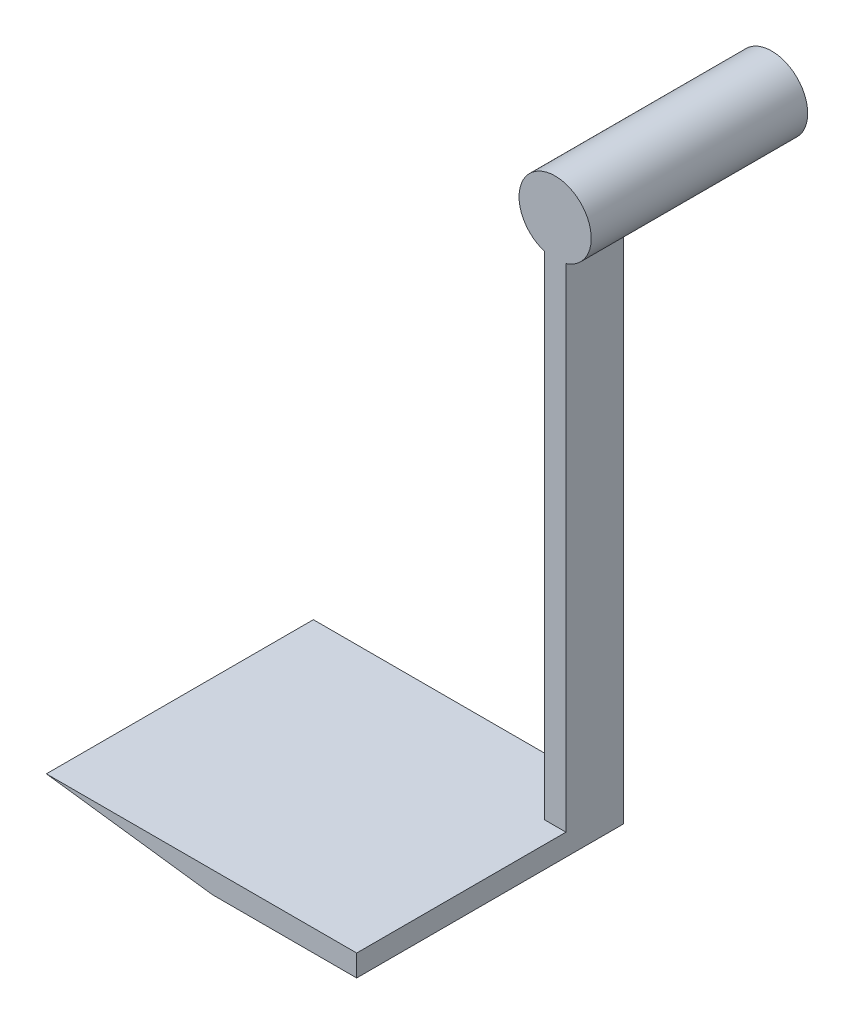
ISO-10303-21;
HEADER;
FILE_DESCRIPTION(('STEP AP214'),'2;1');
FILE_NAME('part.step','',(''),(''),'','','');
FILE_SCHEMA(('AUTOMOTIVE_DESIGN { 1 0 10303 214 1 1 1 1 }'));
ENDSEC;
DATA;
#1=APPLICATION_CONTEXT('core data for automotive mechanical design processes');
#2=APPLICATION_PROTOCOL_DEFINITION('international standard','automotive_design',2000,#1);
#3=PRODUCT_CONTEXT('',#1,'mechanical');
#4=PRODUCT('Part','Part','',(#3));
#5=PRODUCT_RELATED_PRODUCT_CATEGORY('part','',(#4));
#6=PRODUCT_DEFINITION_FORMATION('','',#4);
#7=PRODUCT_DEFINITION_CONTEXT('part definition',#1,'design');
#8=PRODUCT_DEFINITION('design','',#6,#7);
#9=PRODUCT_DEFINITION_SHAPE('','',#8);
#10=(LENGTH_UNIT() NAMED_UNIT(*) SI_UNIT(.MILLI.,.METRE.));
#11=(NAMED_UNIT(*) PLANE_ANGLE_UNIT() SI_UNIT($,.RADIAN.));
#12=(NAMED_UNIT(*) SI_UNIT($,.STERADIAN.) SOLID_ANGLE_UNIT());
#13=UNCERTAINTY_MEASURE_WITH_UNIT(LENGTH_MEASURE(1.E-05),#10,'distance_accuracy_value','');
#14=(GEOMETRIC_REPRESENTATION_CONTEXT(3) GLOBAL_UNCERTAINTY_ASSIGNED_CONTEXT((#13)) GLOBAL_UNIT_ASSIGNED_CONTEXT((#10,
#11,#12)) REPRESENTATION_CONTEXT('',''));
#15=CARTESIAN_POINT('',(0.,0.,0.));
#16=DIRECTION('',(0.,0.,1.));
#17=DIRECTION('',(1.,0.,0.));
#18=AXIS2_PLACEMENT_3D('',#15,#16,#17);
#19=CARTESIAN_POINT('',(-15.4642857142857,71.2211878463906,0.));
#20=DIRECTION('',(0.,0.,1.));
#21=DIRECTION('',(1.,0.,0.));
#22=AXIS2_PLACEMENT_3D('',#19,#20,#21);
#23=PLANE('',#22);
#24=CARTESIAN_POINT('',(-15.4642857142857,71.2211878463906,0.));
#25=DIRECTION('',(0.,0.,-1.));
#26=DIRECTION('',(-1.,0.,0.));
#27=AXIS2_PLACEMENT_3D('',#24,#25,#26);
#28=CIRCLE('',#27,5.);
#29=CARTESIAN_POINT('',(-13.9642857142857,66.4514918393059,0.));
#30=VERTEX_POINT('',#29);
#31=CARTESIAN_POINT('',(-16.9642857142857,66.4514918393059,0.));
#32=VERTEX_POINT('',#31);
#33=EDGE_CURVE('E101',#30,#32,#28,.T.);
#34=ORIENTED_EDGE('',*,*,#33,.F.);
#35=DIRECTION('',(0.,1.,0.));
#36=VECTOR('',#35,1.);
#37=CARTESIAN_POINT('',(-13.9642857142857,-4.77881215360941,0.));
#38=LINE('',#37,#36);
#39=CARTESIAN_POINT('',(-13.9642857142857,-4.77881215360941,0.));
#40=VERTEX_POINT('',#39);
#41=EDGE_CURVE('E104',#40,#30,#38,.T.);
#42=ORIENTED_EDGE('',*,*,#41,.F.);
#43=DIRECTION('',(1.,0.,0.));
#44=VECTOR('',#43,1.);
#45=CARTESIAN_POINT('',(-33.9642857142857,-4.77881215360941,0.));
#46=LINE('',#45,#44);
#47=CARTESIAN_POINT('',(-33.9642857142857,-4.77881215360941,0.));
#48=VERTEX_POINT('',#47);
#49=EDGE_CURVE('E76',#48,#40,#46,.T.);
#50=ORIENTED_EDGE('',*,*,#49,.F.);
#51=DIRECTION('',(0.991600411186222,-0.129339184067768,0.));
#52=VECTOR('',#51,1.);
#53=CARTESIAN_POINT('',(-56.9642857142857,-1.77881215360942,0.));
#54=LINE('',#53,#52);
#55=CARTESIAN_POINT('',(-56.9642857142857,-1.77881215360942,0.));
#56=VERTEX_POINT('',#55);
#57=EDGE_CURVE('E71',#56,#48,#54,.T.);
#58=ORIENTED_EDGE('',*,*,#57,.F.);
#59=DIRECTION('',(-1.,0.,0.));
#60=VECTOR('',#59,1.);
#61=CARTESIAN_POINT('',(-19.7142857142857,-1.77881215360941,0.));
#62=LINE('',#61,#60);
#63=CARTESIAN_POINT('',(-16.9642857142857,-1.77881215360941,0.));
#64=VERTEX_POINT('',#63);
#65=EDGE_CURVE('E146',#64,#56,#62,.T.);
#66=ORIENTED_EDGE('',*,*,#65,.F.);
#67=DIRECTION('',(0.,-1.,0.));
#68=VECTOR('',#67,1.);
#69=CARTESIAN_POINT('',(-16.9642857142857,66.4514918393059,0.));
#70=LINE('',#69,#68);
#71=EDGE_CURVE('E107',#32,#64,#70,.T.);
#72=ORIENTED_EDGE('',*,*,#71,.F.);
#73=EDGE_LOOP('',(#34,#42,#50,#58,#66,#72));
#74=FACE_BOUND('',#73,.T.);
#75=ADVANCED_FACE('F33',(#74),#23,.F.);
#76=CARTESIAN_POINT('',(-15.4642857142857,71.2211878463906,37.));
#77=DIRECTION('',(0.,0.,-1.));
#78=DIRECTION('',(-1.,0.,0.));
#79=AXIS2_PLACEMENT_3D('',#76,#77,#78);
#80=CYLINDRICAL_SURFACE('',#79,5.);
#81=CARTESIAN_POINT('',(-15.4642857142857,71.2211878463906,8.));
#82=DIRECTION('',(0.,0.,-1.));
#83=DIRECTION('',(0.,1.,0.));
#84=AXIS2_PLACEMENT_3D('',#81,#82,#83);
#85=CIRCLE('',#84,5.);
#86=CARTESIAN_POINT('',(-16.9642857142857,66.4514918393059,8.));
#87=VERTEX_POINT('',#86);
#88=CARTESIAN_POINT('',(-13.9642857142857,66.4514918393059,8.));
#89=VERTEX_POINT('',#88);
#90=EDGE_CURVE('E117',#87,#89,#85,.T.);
#91=ORIENTED_EDGE('',*,*,#90,.T.);
#92=DIRECTION('',(0.,0.,-1.));
#93=VECTOR('',#92,1.);
#94=CARTESIAN_POINT('',(-13.9642857142857,66.4514918393059,37.));
#95=LINE('',#94,#93);
#96=EDGE_CURVE('E115',#89,#30,#95,.T.);
#97=ORIENTED_EDGE('',*,*,#96,.T.);
#98=ORIENTED_EDGE('',*,*,#33,.T.);
#99=DIRECTION('',(0.,0.,-1.));
#100=VECTOR('',#99,1.);
#101=CARTESIAN_POINT('',(-16.9642857142857,66.4514918393059,37.));
#102=LINE('',#101,#100);
#103=EDGE_CURVE('E42',#87,#32,#102,.T.);
#104=ORIENTED_EDGE('',*,*,#103,.F.);
#105=EDGE_LOOP('',(#91,#97,#98,#104));
#106=FACE_BOUND('',#105,.T.);
#107=CARTESIAN_POINT('',(-15.4642857142857,71.2211878463906,-22.));
#108=DIRECTION('',(0.,0.,-1.));
#109=DIRECTION('',(-1.,0.,0.));
#110=AXIS2_PLACEMENT_3D('',#107,#108,#109);
#111=CIRCLE('',#110,5.);
#112=CARTESIAN_POINT('',(-20.4642857142857,71.2211878463906,-22.));
#113=VERTEX_POINT('',#112);
#114=EDGE_CURVE('E111',#113,#113,#111,.T.);
#115=ORIENTED_EDGE('',*,*,#114,.F.);
#116=EDGE_LOOP('',(#115));
#117=FACE_BOUND('',#116,.T.);
#118=ADVANCED_FACE('F35',(#106,#117),#80,.T.);
#119=CARTESIAN_POINT('',(-16.9642857142857,66.4514918393059,37.));
#120=DIRECTION('',(1.,0.,0.));
#121=DIRECTION('',(0.,1.,0.));
#122=AXIS2_PLACEMENT_3D('',#119,#120,#121);
#123=PLANE('',#122);
#124=DIRECTION('',(0.,0.,-1.));
#125=VECTOR('',#124,1.);
#126=CARTESIAN_POINT('',(-16.9642857142857,-1.77881215360941,37.));
#127=LINE('',#126,#125);
#128=CARTESIAN_POINT('',(-16.9642857142857,-1.77881215360941,7.99999999999999));
#129=VERTEX_POINT('',#128);
#130=EDGE_CURVE('E136',#129,#64,#127,.T.);
#131=ORIENTED_EDGE('',*,*,#130,.F.);
#132=DIRECTION('',(0.,1.,0.));
#133=VECTOR('',#132,1.);
#134=CARTESIAN_POINT('',(-16.9642857142857,66.4514918393059,8.));
#135=LINE('',#134,#133);
#136=EDGE_CURVE('E141',#129,#87,#135,.T.);
#137=ORIENTED_EDGE('',*,*,#136,.T.);
#138=ORIENTED_EDGE('',*,*,#103,.T.);
#139=ORIENTED_EDGE('',*,*,#71,.T.);
#140=EDGE_LOOP('',(#131,#137,#138,#139));
#141=FACE_BOUND('',#140,.T.);
#142=ADVANCED_FACE('F140',(#141),#123,.F.);
#143=CARTESIAN_POINT('',(-19.7142857142857,-1.77881215360941,37.));
#144=DIRECTION('',(0.,-1.,0.));
#145=DIRECTION('',(1.,0.,0.));
#146=AXIS2_PLACEMENT_3D('',#143,#144,#145);
#147=PLANE('',#146);
#148=DIRECTION('',(-1.,0.,0.));
#149=VECTOR('',#148,1.);
#150=CARTESIAN_POINT('',(-16.9642857142857,-1.77881215360941,37.));
#151=LINE('',#150,#149);
#152=CARTESIAN_POINT('',(-13.9642857142857,-1.77881215360941,37.));
#153=VERTEX_POINT('',#152);
#154=CARTESIAN_POINT('',(-56.9642857142857,-1.77881215360942,37.));
#155=VERTEX_POINT('',#154);
#156=EDGE_CURVE('E80',#153,#155,#151,.T.);
#157=ORIENTED_EDGE('',*,*,#156,.F.);
#158=DIRECTION('',(0.,0.,1.));
#159=VECTOR('',#158,1.);
#160=CARTESIAN_POINT('',(-13.9642857142857,-1.77881215360941,37.));
#161=LINE('',#160,#159);
#162=CARTESIAN_POINT('',(-13.9642857142857,-1.77881215360941,7.99999999999999));
#163=VERTEX_POINT('',#162);
#164=EDGE_CURVE('E148',#163,#153,#161,.T.);
#165=ORIENTED_EDGE('',*,*,#164,.F.);
#166=DIRECTION('',(1.,0.,0.));
#167=VECTOR('',#166,1.);
#168=CARTESIAN_POINT('',(-23.9642857142857,-1.77881215360941,7.99999999999999));
#169=LINE('',#168,#167);
#170=EDGE_CURVE('E246',#129,#163,#169,.T.);
#171=ORIENTED_EDGE('',*,*,#170,.F.);
#172=ORIENTED_EDGE('',*,*,#130,.T.);
#173=ORIENTED_EDGE('',*,*,#65,.T.);
#174=DIRECTION('',(0.,0.,-1.));
#175=VECTOR('',#174,1.);
#176=CARTESIAN_POINT('',(-56.9642857142857,-1.77881215360942,37.));
#177=LINE('',#176,#175);
#178=EDGE_CURVE('E134',#155,#56,#177,.T.);
#179=ORIENTED_EDGE('',*,*,#178,.F.);
#180=EDGE_LOOP('',(#157,#165,#171,#172,#173,#179));
#181=FACE_BOUND('',#180,.T.);
#182=ADVANCED_FACE('F156',(#181),#147,.F.);
#183=CARTESIAN_POINT('',(-56.9642857142857,-1.77881215360942,37.));
#184=DIRECTION('',(0.129339184067768,0.991600411186222,0.));
#185=DIRECTION('',(-0.991600411186222,0.129339184067768,0.));
#186=AXIS2_PLACEMENT_3D('',#183,#184,#185);
#187=PLANE('',#186);
#188=ORIENTED_EDGE('',*,*,#57,.T.);
#189=DIRECTION('',(0.,0.,-1.));
#190=VECTOR('',#189,1.);
#191=CARTESIAN_POINT('',(-33.9642857142857,-4.77881215360941,37.));
#192=LINE('',#191,#190);
#193=CARTESIAN_POINT('',(-33.9642857142857,-4.77881215360941,37.));
#194=VERTEX_POINT('',#193);
#195=EDGE_CURVE('E132',#194,#48,#192,.T.);
#196=ORIENTED_EDGE('',*,*,#195,.F.);
#197=DIRECTION('',(0.991600411186222,-0.129339184067768,0.));
#198=VECTOR('',#197,1.);
#199=CARTESIAN_POINT('',(-56.9642857142857,-1.77881215360942,37.));
#200=LINE('',#199,#198);
#201=EDGE_CURVE('E126',#155,#194,#200,.T.);
#202=ORIENTED_EDGE('',*,*,#201,.F.);
#203=ORIENTED_EDGE('',*,*,#178,.T.);
#204=EDGE_LOOP('',(#188,#196,#202,#203));
#205=FACE_BOUND('',#204,.T.);
#206=ADVANCED_FACE('F158',(#205),#187,.F.);
#207=CARTESIAN_POINT('',(-33.9642857142857,-4.77881215360941,37.));
#208=DIRECTION('',(0.,1.,0.));
#209=DIRECTION('',(-1.,0.,0.));
#210=AXIS2_PLACEMENT_3D('',#207,#208,#209);
#211=PLANE('',#210);
#212=ORIENTED_EDGE('',*,*,#49,.T.);
#213=DIRECTION('',(0.,0.,-1.));
#214=VECTOR('',#213,1.);
#215=CARTESIAN_POINT('',(-13.9642857142857,-4.77881215360941,37.));
#216=LINE('',#215,#214);
#217=CARTESIAN_POINT('',(-13.9642857142857,-4.77881215360941,37.));
#218=VERTEX_POINT('',#217);
#219=EDGE_CURVE('E120',#218,#40,#216,.T.);
#220=ORIENTED_EDGE('',*,*,#219,.F.);
#221=DIRECTION('',(1.,0.,0.));
#222=VECTOR('',#221,1.);
#223=CARTESIAN_POINT('',(-33.9642857142857,-4.77881215360941,37.));
#224=LINE('',#223,#222);
#225=EDGE_CURVE('E50',#194,#218,#224,.T.);
#226=ORIENTED_EDGE('',*,*,#225,.F.);
#227=ORIENTED_EDGE('',*,*,#195,.T.);
#228=EDGE_LOOP('',(#212,#220,#226,#227));
#229=FACE_BOUND('',#228,.T.);
#230=ADVANCED_FACE('F169',(#229),#211,.F.);
#231=CARTESIAN_POINT('',(-13.9642857142857,-4.77881215360941,37.));
#232=DIRECTION('',(-1.,0.,0.));
#233=DIRECTION('',(0.,-1.,0.));
#234=AXIS2_PLACEMENT_3D('',#231,#232,#233);
#235=PLANE('',#234);
#236=ORIENTED_EDGE('',*,*,#96,.F.);
#237=DIRECTION('',(0.,-1.,0.));
#238=VECTOR('',#237,1.);
#239=CARTESIAN_POINT('',(-13.9642857142857,-4.77881215360941,7.99999999999999));
#240=LINE('',#239,#238);
#241=EDGE_CURVE('E11',#89,#163,#240,.T.);
#242=ORIENTED_EDGE('',*,*,#241,.T.);
#243=ORIENTED_EDGE('',*,*,#164,.T.);
#244=DIRECTION('',(0.,1.,0.));
#245=VECTOR('',#244,1.);
#246=CARTESIAN_POINT('',(-13.9642857142857,-4.77881215360941,37.));
#247=LINE('',#246,#245);
#248=EDGE_CURVE('E121',#218,#153,#247,.T.);
#249=ORIENTED_EDGE('',*,*,#248,.F.);
#250=ORIENTED_EDGE('',*,*,#219,.T.);
#251=ORIENTED_EDGE('',*,*,#41,.T.);
#252=EDGE_LOOP('',(#236,#242,#243,#249,#250,#251));
#253=FACE_BOUND('',#252,.T.);
#254=ADVANCED_FACE('F123',(#253),#235,.F.);
#255=CARTESIAN_POINT('',(-15.4642857142857,71.2211878463906,37.));
#256=DIRECTION('',(0.,0.,1.));
#257=DIRECTION('',(1.,0.,0.));
#258=AXIS2_PLACEMENT_3D('',#255,#256,#257);
#259=PLANE('',#258);
#260=ORIENTED_EDGE('',*,*,#248,.T.);
#261=ORIENTED_EDGE('',*,*,#156,.T.);
#262=ORIENTED_EDGE('',*,*,#201,.T.);
#263=ORIENTED_EDGE('',*,*,#225,.T.);
#264=EDGE_LOOP('',(#260,#261,#262,#263));
#265=FACE_BOUND('',#264,.T.);
#266=ADVANCED_FACE('F159',(#265),#259,.T.);
#267=CARTESIAN_POINT('',(-23.9642857142857,76.2211878463906,8.));
#268=DIRECTION('',(0.,0.,-1.));
#269=DIRECTION('',(0.,1.,0.));
#270=AXIS2_PLACEMENT_3D('',#267,#268,#269);
#271=PLANE('',#270);
#272=ORIENTED_EDGE('',*,*,#170,.T.);
#273=ORIENTED_EDGE('',*,*,#241,.F.);
#274=ORIENTED_EDGE('',*,*,#90,.F.);
#275=ORIENTED_EDGE('',*,*,#136,.F.);
#276=EDGE_LOOP('',(#272,#273,#274,#275));
#277=FACE_BOUND('',#276,.T.);
#278=ADVANCED_FACE('F161',(#277),#271,.F.);
#279=CARTESIAN_POINT('',(-15.4642857142857,71.2211878463906,-22.));
#280=DIRECTION('',(0.,0.,-1.));
#281=DIRECTION('',(-1.,0.,0.));
#282=AXIS2_PLACEMENT_3D('',#279,#280,#281);
#283=PLANE('',#282);
#284=CARTESIAN_POINT('',(-15.4642857142857,71.2211878463906,-22.));
#285=DIRECTION('',(0.,0.,-1.));
#286=DIRECTION('',(-1.,0.,0.));
#287=AXIS2_PLACEMENT_3D('',#284,#285,#286);
#288=CIRCLE('',#287,2.5);
#289=CARTESIAN_POINT('',(-17.9642857142857,71.2211878463906,-22.));
#290=VERTEX_POINT('',#289);
#291=EDGE_CURVE('E240',#290,#290,#288,.T.);
#292=ORIENTED_EDGE('',*,*,#291,.F.);
#293=EDGE_LOOP('',(#292));
#294=FACE_BOUND('',#293,.T.);
#295=ORIENTED_EDGE('',*,*,#114,.T.);
#296=EDGE_LOOP('',(#295));
#297=FACE_BOUND('',#296,.T.);
#298=ADVANCED_FACE('F167',(#294,#297),#283,.T.);
#299=CARTESIAN_POINT('',(-15.4642857142857,71.2211878463906,-2.));
#300=DIRECTION('',(0.,0.,-1.));
#301=DIRECTION('',(-1.,0.,0.));
#302=AXIS2_PLACEMENT_3D('',#299,#300,#301);
#303=CYLINDRICAL_SURFACE('',#302,2.5);
#304=CARTESIAN_POINT('',(-15.4642857142857,71.2211878463906,-2.));
#305=DIRECTION('',(0.,0.,-1.));
#306=DIRECTION('',(-1.,0.,0.));
#307=AXIS2_PLACEMENT_3D('',#304,#305,#306);
#308=CIRCLE('',#307,2.5);
#309=CARTESIAN_POINT('',(-17.9642857142857,71.2211878463906,-2.));
#310=VERTEX_POINT('',#309);
#311=EDGE_CURVE('E112',#310,#310,#308,.T.);
#312=ORIENTED_EDGE('',*,*,#311,.F.);
#313=EDGE_LOOP('',(#312));
#314=FACE_BOUND('',#313,.T.);
#315=ORIENTED_EDGE('',*,*,#291,.T.);
#316=EDGE_LOOP('',(#315));
#317=FACE_BOUND('',#316,.T.);
#318=ADVANCED_FACE('F213',(#314,#317),#303,.F.);
#319=CARTESIAN_POINT('',(-15.4642857142857,71.2211878463906,-2.));
#320=DIRECTION('',(0.,0.,-1.));
#321=DIRECTION('',(-1.,0.,0.));
#322=AXIS2_PLACEMENT_3D('',#319,#320,#321);
#323=PLANE('',#322);
#324=ORIENTED_EDGE('',*,*,#311,.T.);
#325=EDGE_LOOP('',(#324));
#326=FACE_BOUND('',#325,.T.);
#327=ADVANCED_FACE('F224',(#326),#323,.T.);
#328=CLOSED_SHELL('',(#75,#118,#142,#182,#206,#230,#254,#266,#278,#298,#318,#327));
#329=MANIFOLD_SOLID_BREP('B2',#328);
#330=ADVANCED_BREP_SHAPE_REPRESENTATION('',(#18,#329),#14);
#331=SHAPE_DEFINITION_REPRESENTATION(#9,#330);
ENDSEC;
END-ISO-10303-21;
